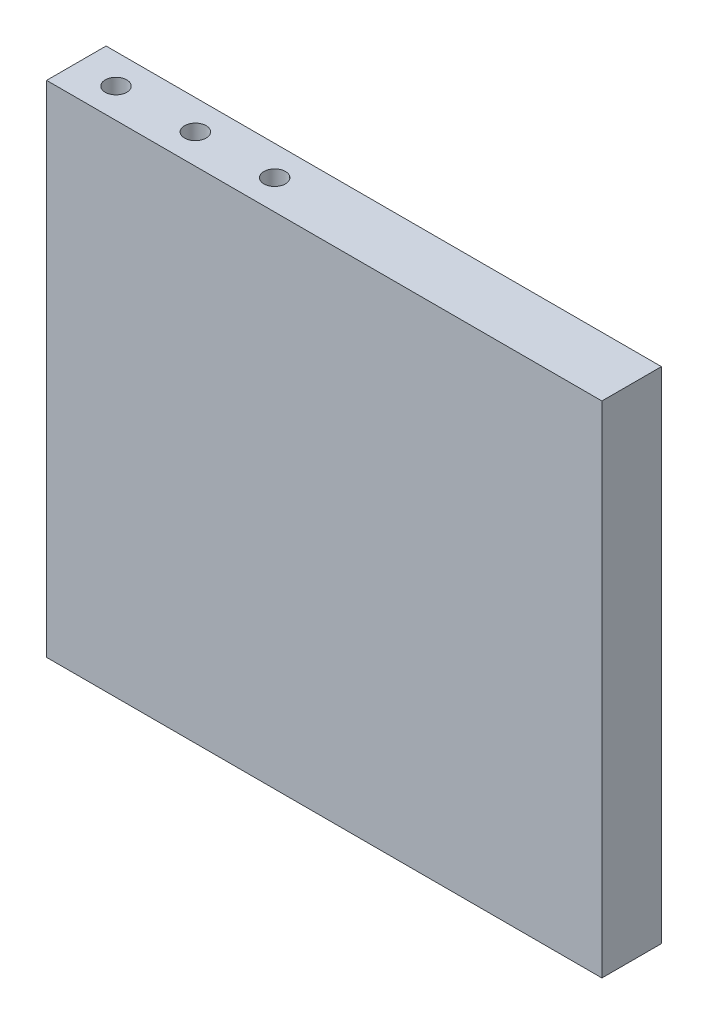
ISO-10303-21;
HEADER;
FILE_DESCRIPTION(('STEP AP214'),'2;1');
FILE_NAME('part.step','',(''),(''),'','','');
FILE_SCHEMA(('AUTOMOTIVE_DESIGN { 1 0 10303 214 1 1 1 1 }'));
ENDSEC;
DATA;
#1=APPLICATION_CONTEXT('core data for automotive mechanical design processes');
#2=APPLICATION_PROTOCOL_DEFINITION('international standard','automotive_design',2000,#1);
#3=PRODUCT_CONTEXT('',#1,'mechanical');
#4=PRODUCT('Part','Part','',(#3));
#5=PRODUCT_RELATED_PRODUCT_CATEGORY('part','',(#4));
#6=PRODUCT_DEFINITION_FORMATION('','',#4);
#7=PRODUCT_DEFINITION_CONTEXT('part definition',#1,'design');
#8=PRODUCT_DEFINITION('design','',#6,#7);
#9=PRODUCT_DEFINITION_SHAPE('','',#8);
#10=(LENGTH_UNIT() NAMED_UNIT(*) SI_UNIT(.MILLI.,.METRE.));
#11=(NAMED_UNIT(*) PLANE_ANGLE_UNIT() SI_UNIT($,.RADIAN.));
#12=(NAMED_UNIT(*) SI_UNIT($,.STERADIAN.) SOLID_ANGLE_UNIT());
#13=UNCERTAINTY_MEASURE_WITH_UNIT(LENGTH_MEASURE(1.E-05),#10,'distance_accuracy_value','');
#14=(GEOMETRIC_REPRESENTATION_CONTEXT(3) GLOBAL_UNCERTAINTY_ASSIGNED_CONTEXT((#13)) GLOBAL_UNIT_ASSIGNED_CONTEXT((#10,
#11,#12)) REPRESENTATION_CONTEXT('',''));
#15=CARTESIAN_POINT('',(0.,0.,0.));
#16=DIRECTION('',(0.,0.,1.));
#17=DIRECTION('',(1.,0.,0.));
#18=AXIS2_PLACEMENT_3D('',#15,#16,#17);
#19=CARTESIAN_POINT('',(-38.691485352155,80.,9.525));
#20=DIRECTION('',(1.,0.,0.));
#21=DIRECTION('',(0.,0.,1.));
#22=AXIS2_PLACEMENT_3D('',#19,#20,#21);
#23=PLANE('',#22);
#24=DIRECTION('',(0.,0.,-1.));
#25=VECTOR('',#24,1.);
#26=CARTESIAN_POINT('',(-38.691485352155,0.,9.525));
#27=LINE('',#26,#25);
#28=CARTESIAN_POINT('',(-38.691485352155,0.,9.525));
#29=VERTEX_POINT('',#28);
#30=CARTESIAN_POINT('',(-38.691485352155,0.,0.));
#31=VERTEX_POINT('',#30);
#32=EDGE_CURVE('E170',#29,#31,#27,.T.);
#33=ORIENTED_EDGE('',*,*,#32,.F.);
#34=DIRECTION('',(0.,-1.,0.));
#35=VECTOR('',#34,1.);
#36=CARTESIAN_POINT('',(-38.691485352155,80.,9.525));
#37=LINE('',#36,#35);
#38=CARTESIAN_POINT('',(-38.691485352155,80.,9.525));
#39=VERTEX_POINT('',#38);
#40=EDGE_CURVE('E179',#39,#29,#37,.T.);
#41=ORIENTED_EDGE('',*,*,#40,.F.);
#42=DIRECTION('',(0.,0.,-1.));
#43=VECTOR('',#42,1.);
#44=CARTESIAN_POINT('',(-38.691485352155,80.,9.525));
#45=LINE('',#44,#43);
#46=CARTESIAN_POINT('',(-38.691485352155,80.,0.));
#47=VERTEX_POINT('',#46);
#48=EDGE_CURVE('E171',#39,#47,#45,.T.);
#49=ORIENTED_EDGE('',*,*,#48,.T.);
#50=DIRECTION('',(0.,-1.,0.));
#51=VECTOR('',#50,1.);
#52=CARTESIAN_POINT('',(-38.691485352155,80.,0.));
#53=LINE('',#52,#51);
#54=EDGE_CURVE('E11',#47,#31,#53,.T.);
#55=ORIENTED_EDGE('',*,*,#54,.T.);
#56=EDGE_LOOP('',(#33,#41,#49,#55));
#57=FACE_BOUND('',#56,.T.);
#58=ADVANCED_FACE('F36',(#57),#23,.F.);
#59=CARTESIAN_POINT('',(-38.691485352155,80.,0.));
#60=DIRECTION('',(0.,0.,1.));
#61=DIRECTION('',(-1.,0.,0.));
#62=AXIS2_PLACEMENT_3D('',#59,#60,#61);
#63=PLANE('',#62);
#64=CARTESIAN_POINT('',(43.858514647845,64.,0.));
#65=DIRECTION('',(0.,0.,1.));
#66=DIRECTION('',(1.,0.,0.));
#67=AXIS2_PLACEMENT_3D('',#64,#65,#66);
#68=CIRCLE('',#67,1.7272);
#69=CARTESIAN_POINT('',(45.585714647845,64.,0.));
#70=VERTEX_POINT('',#69);
#71=EDGE_CURVE('E118',#70,#70,#68,.T.);
#72=ORIENTED_EDGE('',*,*,#71,.T.);
#73=EDGE_LOOP('',(#72));
#74=FACE_BOUND('',#73,.T.);
#75=CARTESIAN_POINT('',(43.858514647845,48.,0.));
#76=DIRECTION('',(0.,0.,1.));
#77=DIRECTION('',(1.,0.,0.));
#78=AXIS2_PLACEMENT_3D('',#75,#76,#77);
#79=CIRCLE('',#78,1.7272);
#80=CARTESIAN_POINT('',(45.585714647845,48.,0.));
#81=VERTEX_POINT('',#80);
#82=EDGE_CURVE('E117',#81,#81,#79,.T.);
#83=ORIENTED_EDGE('',*,*,#82,.T.);
#84=EDGE_LOOP('',(#83));
#85=FACE_BOUND('',#84,.T.);
#86=CARTESIAN_POINT('',(43.858514647845,32.,0.));
#87=DIRECTION('',(0.,0.,1.));
#88=DIRECTION('',(1.,0.,0.));
#89=AXIS2_PLACEMENT_3D('',#86,#87,#88);
#90=CIRCLE('',#89,1.7272);
#91=CARTESIAN_POINT('',(45.585714647845,32.,0.));
#92=VERTEX_POINT('',#91);
#93=EDGE_CURVE('E128',#92,#92,#90,.T.);
#94=ORIENTED_EDGE('',*,*,#93,.T.);
#95=EDGE_LOOP('',(#94));
#96=FACE_BOUND('',#95,.T.);
#97=CARTESIAN_POINT('',(43.858514647845,16.,0.));
#98=DIRECTION('',(0.,0.,1.));
#99=DIRECTION('',(1.,0.,0.));
#100=AXIS2_PLACEMENT_3D('',#97,#98,#99);
#101=CIRCLE('',#100,1.7272);
#102=CARTESIAN_POINT('',(45.585714647845,16.,0.));
#103=VERTEX_POINT('',#102);
#104=EDGE_CURVE('E134',#103,#103,#101,.T.);
#105=ORIENTED_EDGE('',*,*,#104,.T.);
#106=EDGE_LOOP('',(#105));
#107=FACE_BOUND('',#106,.T.);
#108=DIRECTION('',(1.,0.,0.));
#109=VECTOR('',#108,1.);
#110=CARTESIAN_POINT('',(-38.691485352155,0.,0.));
#111=LINE('',#110,#109);
#112=CARTESIAN_POINT('',(50.208514647845,0.,0.));
#113=VERTEX_POINT('',#112);
#114=EDGE_CURVE('E181',#31,#113,#111,.T.);
#115=ORIENTED_EDGE('',*,*,#114,.F.);
#116=ORIENTED_EDGE('',*,*,#54,.F.);
#117=DIRECTION('',(1.,0.,0.));
#118=VECTOR('',#117,1.);
#119=CARTESIAN_POINT('',(-38.691485352155,80.,0.));
#120=LINE('',#119,#118);
#121=CARTESIAN_POINT('',(50.208514647845,80.,0.));
#122=VERTEX_POINT('',#121);
#123=EDGE_CURVE('E78',#47,#122,#120,.T.);
#124=ORIENTED_EDGE('',*,*,#123,.T.);
#125=DIRECTION('',(0.,-1.,0.));
#126=VECTOR('',#125,1.);
#127=CARTESIAN_POINT('',(50.208514647845,80.,0.));
#128=LINE('',#127,#126);
#129=EDGE_CURVE('E44',#122,#113,#128,.T.);
#130=ORIENTED_EDGE('',*,*,#129,.T.);
#131=EDGE_LOOP('',(#115,#116,#124,#130));
#132=FACE_BOUND('',#131,.T.);
#133=ADVANCED_FACE('F192',(#74,#85,#96,#107,#132),#63,.F.);
#134=CARTESIAN_POINT('',(50.208514647845,80.,9.525));
#135=DIRECTION('',(-1.,0.,0.));
#136=DIRECTION('',(0.,0.,-1.));
#137=AXIS2_PLACEMENT_3D('',#134,#135,#136);
#138=PLANE('',#137);
#139=DIRECTION('',(0.,0.,1.));
#140=VECTOR('',#139,1.);
#141=CARTESIAN_POINT('',(50.208514647845,0.,9.525));
#142=LINE('',#141,#140);
#143=CARTESIAN_POINT('',(50.208514647845,0.,9.525));
#144=VERTEX_POINT('',#143);
#145=EDGE_CURVE('E184',#113,#144,#142,.T.);
#146=ORIENTED_EDGE('',*,*,#145,.F.);
#147=ORIENTED_EDGE('',*,*,#129,.F.);
#148=DIRECTION('',(0.,0.,1.));
#149=VECTOR('',#148,1.);
#150=CARTESIAN_POINT('',(50.208514647845,80.,9.525));
#151=LINE('',#150,#149);
#152=CARTESIAN_POINT('',(50.208514647845,80.,9.525));
#153=VERTEX_POINT('',#152);
#154=EDGE_CURVE('E175',#122,#153,#151,.T.);
#155=ORIENTED_EDGE('',*,*,#154,.T.);
#156=DIRECTION('',(0.,-1.,0.));
#157=VECTOR('',#156,1.);
#158=CARTESIAN_POINT('',(50.208514647845,80.,9.525));
#159=LINE('',#158,#157);
#160=EDGE_CURVE('E188',#153,#144,#159,.T.);
#161=ORIENTED_EDGE('',*,*,#160,.T.);
#162=EDGE_LOOP('',(#146,#147,#155,#161));
#163=FACE_BOUND('',#162,.T.);
#164=ADVANCED_FACE('F200',(#163),#138,.F.);
#165=CARTESIAN_POINT('',(-38.691485352155,80.,9.525));
#166=DIRECTION('',(0.,0.,-1.));
#167=DIRECTION('',(1.,0.,0.));
#168=AXIS2_PLACEMENT_3D('',#165,#166,#167);
#169=PLANE('',#168);
#170=DIRECTION('',(-1.,0.,0.));
#171=VECTOR('',#170,1.);
#172=CARTESIAN_POINT('',(-38.691485352155,0.,9.525));
#173=LINE('',#172,#171);
#174=EDGE_CURVE('E67',#144,#29,#173,.T.);
#175=ORIENTED_EDGE('',*,*,#174,.F.);
#176=ORIENTED_EDGE('',*,*,#160,.F.);
#177=DIRECTION('',(-1.,0.,0.));
#178=VECTOR('',#177,1.);
#179=CARTESIAN_POINT('',(-38.691485352155,80.,9.525));
#180=LINE('',#179,#178);
#181=EDGE_CURVE('E52',#153,#39,#180,.T.);
#182=ORIENTED_EDGE('',*,*,#181,.T.);
#183=ORIENTED_EDGE('',*,*,#40,.T.);
#184=EDGE_LOOP('',(#175,#176,#182,#183));
#185=FACE_BOUND('',#184,.T.);
#186=ADVANCED_FACE('F199',(#185),#169,.F.);
#187=CARTESIAN_POINT('',(0.,80.,0.));
#188=DIRECTION('',(0.,1.,0.));
#189=DIRECTION('',(0.,0.,-1.));
#190=AXIS2_PLACEMENT_3D('',#187,#188,#189);
#191=PLANE('',#190);
#192=CARTESIAN_POINT('',(-32.341485352155,80.,4.7625));
#193=DIRECTION('',(0.,-1.,0.));
#194=DIRECTION('',(0.,0.,-1.));
#195=AXIS2_PLACEMENT_3D('',#192,#193,#194);
#196=CIRCLE('',#195,1.7272);
#197=CARTESIAN_POINT('',(-32.341485352155,80.,3.0353));
#198=VERTEX_POINT('',#197);
#199=EDGE_CURVE('E140',#198,#198,#196,.T.);
#200=ORIENTED_EDGE('',*,*,#199,.T.);
#201=EDGE_LOOP('',(#200));
#202=FACE_BOUND('',#201,.T.);
#203=CARTESIAN_POINT('',(-19.641485352155,80.,4.7625));
#204=DIRECTION('',(0.,-1.,0.));
#205=DIRECTION('',(0.,0.,-1.));
#206=AXIS2_PLACEMENT_3D('',#203,#204,#205);
#207=CIRCLE('',#206,1.7272);
#208=CARTESIAN_POINT('',(-19.641485352155,80.,3.0353));
#209=VERTEX_POINT('',#208);
#210=EDGE_CURVE('E146',#209,#209,#207,.T.);
#211=ORIENTED_EDGE('',*,*,#210,.T.);
#212=EDGE_LOOP('',(#211));
#213=FACE_BOUND('',#212,.T.);
#214=CARTESIAN_POINT('',(-6.94148535215502,80.,4.7625));
#215=DIRECTION('',(0.,-1.,0.));
#216=DIRECTION('',(0.,0.,-1.));
#217=AXIS2_PLACEMENT_3D('',#214,#215,#216);
#218=CIRCLE('',#217,1.7272);
#219=CARTESIAN_POINT('',(-6.94148535215502,80.,3.0353));
#220=VERTEX_POINT('',#219);
#221=EDGE_CURVE('E152',#220,#220,#218,.T.);
#222=ORIENTED_EDGE('',*,*,#221,.T.);
#223=EDGE_LOOP('',(#222));
#224=FACE_BOUND('',#223,.T.);
#225=ORIENTED_EDGE('',*,*,#48,.F.);
#226=ORIENTED_EDGE('',*,*,#181,.F.);
#227=ORIENTED_EDGE('',*,*,#154,.F.);
#228=ORIENTED_EDGE('',*,*,#123,.F.);
#229=EDGE_LOOP('',(#225,#226,#227,#228));
#230=FACE_BOUND('',#229,.T.);
#231=ADVANCED_FACE('F198',(#202,#213,#224,#230),#191,.T.);
#232=CARTESIAN_POINT('',(0.,0.,0.));
#233=DIRECTION('',(0.,1.,0.));
#234=DIRECTION('',(0.,0.,-1.));
#235=AXIS2_PLACEMENT_3D('',#232,#233,#234);
#236=PLANE('',#235);
#237=CARTESIAN_POINT('',(-25.991485352155,0.,4.7625));
#238=DIRECTION('',(0.,1.,0.));
#239=DIRECTION('',(0.,0.,1.));
#240=AXIS2_PLACEMENT_3D('',#237,#238,#239);
#241=CIRCLE('',#240,1.7272);
#242=CARTESIAN_POINT('',(-25.991485352155,0.,6.4897));
#243=VERTEX_POINT('',#242);
#244=EDGE_CURVE('E158',#243,#243,#241,.T.);
#245=ORIENTED_EDGE('',*,*,#244,.T.);
#246=EDGE_LOOP('',(#245));
#247=FACE_BOUND('',#246,.T.);
#248=CARTESIAN_POINT('',(12.108514647845,0.,4.7625));
#249=DIRECTION('',(0.,1.,0.));
#250=DIRECTION('',(0.,0.,1.));
#251=AXIS2_PLACEMENT_3D('',#248,#249,#250);
#252=CIRCLE('',#251,1.7272);
#253=CARTESIAN_POINT('',(12.108514647845,0.,6.4897));
#254=VERTEX_POINT('',#253);
#255=EDGE_CURVE('E164',#254,#254,#252,.T.);
#256=ORIENTED_EDGE('',*,*,#255,.T.);
#257=EDGE_LOOP('',(#256));
#258=FACE_BOUND('',#257,.T.);
#259=ORIENTED_EDGE('',*,*,#32,.T.);
#260=ORIENTED_EDGE('',*,*,#114,.T.);
#261=ORIENTED_EDGE('',*,*,#145,.T.);
#262=ORIENTED_EDGE('',*,*,#174,.T.);
#263=EDGE_LOOP('',(#259,#260,#261,#262));
#264=FACE_BOUND('',#263,.T.);
#265=ADVANCED_FACE('F194',(#247,#258,#264),#236,.F.);
#266=CARTESIAN_POINT('',(12.108514647845,10.668,4.7625));
#267=DIRECTION('',(0.,-1.,0.));
#268=DIRECTION('',(0.,0.,1.));
#269=AXIS2_PLACEMENT_3D('',#266,#267,#268);
#270=CONICAL_SURFACE('',#269,1.7272,1.02974425867665);
#271=CARTESIAN_POINT('',(12.108514647845,11.7058064611844,4.7625));
#272=VERTEX_POINT('',#271);
#273=VERTEX_LOOP('',#272);
#274=FACE_BOUND('',#273,.T.);
#275=CARTESIAN_POINT('',(12.108514647845,10.668,4.7625));
#276=DIRECTION('',(0.,1.,0.));
#277=DIRECTION('',(0.,0.,1.));
#278=AXIS2_PLACEMENT_3D('',#275,#276,#277);
#279=CIRCLE('',#278,1.7272);
#280=CARTESIAN_POINT('',(12.108514647845,10.668,6.4897));
#281=VERTEX_POINT('',#280);
#282=EDGE_CURVE('E167',#281,#281,#279,.T.);
#283=ORIENTED_EDGE('',*,*,#282,.F.);
#284=EDGE_LOOP('',(#283));
#285=FACE_BOUND('',#284,.T.);
#286=ADVANCED_FACE('F246',(#274,#285),#270,.F.);
#287=CARTESIAN_POINT('',(12.108514647845,0.,4.7625));
#288=DIRECTION('',(0.,-1.,0.));
#289=DIRECTION('',(0.,0.,1.));
#290=AXIS2_PLACEMENT_3D('',#287,#288,#289);
#291=CYLINDRICAL_SURFACE('',#290,1.7272);
#292=ORIENTED_EDGE('',*,*,#282,.T.);
#293=EDGE_LOOP('',(#292));
#294=FACE_BOUND('',#293,.T.);
#295=ORIENTED_EDGE('',*,*,#255,.F.);
#296=EDGE_LOOP('',(#295));
#297=FACE_BOUND('',#296,.T.);
#298=ADVANCED_FACE('F256',(#294,#297),#291,.F.);
#299=CARTESIAN_POINT('',(-25.991485352155,10.668,4.7625));
#300=DIRECTION('',(0.,-1.,0.));
#301=DIRECTION('',(0.,0.,1.));
#302=AXIS2_PLACEMENT_3D('',#299,#300,#301);
#303=CONICAL_SURFACE('',#302,1.7272,1.02974425867665);
#304=CARTESIAN_POINT('',(-25.991485352155,11.7058064611844,4.7625));
#305=VERTEX_POINT('',#304);
#306=VERTEX_LOOP('',#305);
#307=FACE_BOUND('',#306,.T.);
#308=CARTESIAN_POINT('',(-25.991485352155,10.668,4.7625));
#309=DIRECTION('',(0.,1.,0.));
#310=DIRECTION('',(0.,0.,1.));
#311=AXIS2_PLACEMENT_3D('',#308,#309,#310);
#312=CIRCLE('',#311,1.7272);
#313=CARTESIAN_POINT('',(-25.991485352155,10.668,6.4897));
#314=VERTEX_POINT('',#313);
#315=EDGE_CURVE('E161',#314,#314,#312,.T.);
#316=ORIENTED_EDGE('',*,*,#315,.F.);
#317=EDGE_LOOP('',(#316));
#318=FACE_BOUND('',#317,.T.);
#319=ADVANCED_FACE('F267',(#307,#318),#303,.F.);
#320=CARTESIAN_POINT('',(-25.991485352155,0.,4.7625));
#321=DIRECTION('',(0.,-1.,0.));
#322=DIRECTION('',(0.,0.,1.));
#323=AXIS2_PLACEMENT_3D('',#320,#321,#322);
#324=CYLINDRICAL_SURFACE('',#323,1.7272);
#325=ORIENTED_EDGE('',*,*,#315,.T.);
#326=EDGE_LOOP('',(#325));
#327=FACE_BOUND('',#326,.T.);
#328=ORIENTED_EDGE('',*,*,#244,.F.);
#329=EDGE_LOOP('',(#328));
#330=FACE_BOUND('',#329,.T.);
#331=ADVANCED_FACE('F278',(#327,#330),#324,.F.);
#332=CARTESIAN_POINT('',(-6.94148535215502,69.332,4.7625));
#333=DIRECTION('',(0.,1.,0.));
#334=DIRECTION('',(0.,0.,-1.));
#335=AXIS2_PLACEMENT_3D('',#332,#333,#334);
#336=CONICAL_SURFACE('',#335,1.7272,1.02974425867665);
#337=CARTESIAN_POINT('',(-6.94148535215503,68.2941935388156,4.7625));
#338=VERTEX_POINT('',#337);
#339=VERTEX_LOOP('',#338);
#340=FACE_BOUND('',#339,.T.);
#341=CARTESIAN_POINT('',(-6.94148535215502,69.332,4.7625));
#342=DIRECTION('',(0.,-1.,0.));
#343=DIRECTION('',(0.,0.,-1.));
#344=AXIS2_PLACEMENT_3D('',#341,#342,#343);
#345=CIRCLE('',#344,1.7272);
#346=CARTESIAN_POINT('',(-6.94148535215502,69.332,3.0353));
#347=VERTEX_POINT('',#346);
#348=EDGE_CURVE('E155',#347,#347,#345,.T.);
#349=ORIENTED_EDGE('',*,*,#348,.F.);
#350=EDGE_LOOP('',(#349));
#351=FACE_BOUND('',#350,.T.);
#352=ADVANCED_FACE('F289',(#340,#351),#336,.F.);
#353=CARTESIAN_POINT('',(-6.94148535215502,80.,4.7625));
#354=DIRECTION('',(0.,1.,0.));
#355=DIRECTION('',(0.,0.,-1.));
#356=AXIS2_PLACEMENT_3D('',#353,#354,#355);
#357=CYLINDRICAL_SURFACE('',#356,1.7272);
#358=ORIENTED_EDGE('',*,*,#348,.T.);
#359=EDGE_LOOP('',(#358));
#360=FACE_BOUND('',#359,.T.);
#361=ORIENTED_EDGE('',*,*,#221,.F.);
#362=EDGE_LOOP('',(#361));
#363=FACE_BOUND('',#362,.T.);
#364=ADVANCED_FACE('F300',(#360,#363),#357,.F.);
#365=CARTESIAN_POINT('',(-19.641485352155,69.332,4.7625));
#366=DIRECTION('',(0.,1.,0.));
#367=DIRECTION('',(0.,0.,-1.));
#368=AXIS2_PLACEMENT_3D('',#365,#366,#367);
#369=CONICAL_SURFACE('',#368,1.7272,1.02974425867665);
#370=CARTESIAN_POINT('',(-19.641485352155,68.2941935388156,4.7625));
#371=VERTEX_POINT('',#370);
#372=VERTEX_LOOP('',#371);
#373=FACE_BOUND('',#372,.T.);
#374=CARTESIAN_POINT('',(-19.641485352155,69.332,4.7625));
#375=DIRECTION('',(0.,-1.,0.));
#376=DIRECTION('',(0.,0.,-1.));
#377=AXIS2_PLACEMENT_3D('',#374,#375,#376);
#378=CIRCLE('',#377,1.7272);
#379=CARTESIAN_POINT('',(-19.641485352155,69.332,3.0353));
#380=VERTEX_POINT('',#379);
#381=EDGE_CURVE('E149',#380,#380,#378,.T.);
#382=ORIENTED_EDGE('',*,*,#381,.F.);
#383=EDGE_LOOP('',(#382));
#384=FACE_BOUND('',#383,.T.);
#385=ADVANCED_FACE('F311',(#373,#384),#369,.F.);
#386=CARTESIAN_POINT('',(-19.641485352155,80.,4.7625));
#387=DIRECTION('',(0.,1.,0.));
#388=DIRECTION('',(0.,0.,-1.));
#389=AXIS2_PLACEMENT_3D('',#386,#387,#388);
#390=CYLINDRICAL_SURFACE('',#389,1.7272);
#391=ORIENTED_EDGE('',*,*,#381,.T.);
#392=EDGE_LOOP('',(#391));
#393=FACE_BOUND('',#392,.T.);
#394=ORIENTED_EDGE('',*,*,#210,.F.);
#395=EDGE_LOOP('',(#394));
#396=FACE_BOUND('',#395,.T.);
#397=ADVANCED_FACE('F322',(#393,#396),#390,.F.);
#398=CARTESIAN_POINT('',(-32.341485352155,69.332,4.7625));
#399=DIRECTION('',(0.,1.,0.));
#400=DIRECTION('',(0.,0.,-1.));
#401=AXIS2_PLACEMENT_3D('',#398,#399,#400);
#402=CONICAL_SURFACE('',#401,1.7272,1.02974425867666);
#403=CARTESIAN_POINT('',(-32.341485352155,68.2941935388156,4.7625));
#404=VERTEX_POINT('',#403);
#405=VERTEX_LOOP('',#404);
#406=FACE_BOUND('',#405,.T.);
#407=CARTESIAN_POINT('',(-32.341485352155,69.332,4.7625));
#408=DIRECTION('',(0.,-1.,0.));
#409=DIRECTION('',(0.,0.,-1.));
#410=AXIS2_PLACEMENT_3D('',#407,#408,#409);
#411=CIRCLE('',#410,1.7272);
#412=CARTESIAN_POINT('',(-32.341485352155,69.332,3.0353));
#413=VERTEX_POINT('',#412);
#414=EDGE_CURVE('E143',#413,#413,#411,.T.);
#415=ORIENTED_EDGE('',*,*,#414,.F.);
#416=EDGE_LOOP('',(#415));
#417=FACE_BOUND('',#416,.T.);
#418=ADVANCED_FACE('F333',(#406,#417),#402,.F.);
#419=CARTESIAN_POINT('',(-32.341485352155,80.,4.7625));
#420=DIRECTION('',(0.,1.,0.));
#421=DIRECTION('',(0.,0.,-1.));
#422=AXIS2_PLACEMENT_3D('',#419,#420,#421);
#423=CYLINDRICAL_SURFACE('',#422,1.7272);
#424=ORIENTED_EDGE('',*,*,#414,.T.);
#425=EDGE_LOOP('',(#424));
#426=FACE_BOUND('',#425,.T.);
#427=ORIENTED_EDGE('',*,*,#199,.F.);
#428=EDGE_LOOP('',(#427));
#429=FACE_BOUND('',#428,.T.);
#430=ADVANCED_FACE('F344',(#426,#429),#423,.F.);
#431=CARTESIAN_POINT('',(43.858514647845,16.,7.62));
#432=DIRECTION('',(0.,0.,-1.));
#433=DIRECTION('',(1.,0.,0.));
#434=AXIS2_PLACEMENT_3D('',#431,#432,#433);
#435=CONICAL_SURFACE('',#434,1.7272,1.02974425867665);
#436=CARTESIAN_POINT('',(43.858514647845,16.,8.6578064611844));
#437=VERTEX_POINT('',#436);
#438=VERTEX_LOOP('',#437);
#439=FACE_BOUND('',#438,.T.);
#440=CARTESIAN_POINT('',(43.858514647845,16.,7.62));
#441=DIRECTION('',(0.,0.,1.));
#442=DIRECTION('',(1.,0.,0.));
#443=AXIS2_PLACEMENT_3D('',#440,#441,#442);
#444=CIRCLE('',#443,1.7272);
#445=CARTESIAN_POINT('',(45.585714647845,16.,7.62));
#446=VERTEX_POINT('',#445);
#447=EDGE_CURVE('E137',#446,#446,#444,.T.);
#448=ORIENTED_EDGE('',*,*,#447,.F.);
#449=EDGE_LOOP('',(#448));
#450=FACE_BOUND('',#449,.T.);
#451=ADVANCED_FACE('F355',(#439,#450),#435,.F.);
#452=CARTESIAN_POINT('',(43.858514647845,16.,0.));
#453=DIRECTION('',(0.,0.,-1.));
#454=DIRECTION('',(1.,0.,0.));
#455=AXIS2_PLACEMENT_3D('',#452,#453,#454);
#456=CYLINDRICAL_SURFACE('',#455,1.7272);
#457=ORIENTED_EDGE('',*,*,#447,.T.);
#458=EDGE_LOOP('',(#457));
#459=FACE_BOUND('',#458,.T.);
#460=ORIENTED_EDGE('',*,*,#104,.F.);
#461=EDGE_LOOP('',(#460));
#462=FACE_BOUND('',#461,.T.);
#463=ADVANCED_FACE('F366',(#459,#462),#456,.F.);
#464=CARTESIAN_POINT('',(43.858514647845,32.,7.62));
#465=DIRECTION('',(0.,0.,-1.));
#466=DIRECTION('',(1.,0.,0.));
#467=AXIS2_PLACEMENT_3D('',#464,#465,#466);
#468=CONICAL_SURFACE('',#467,1.7272,1.02974425867665);
#469=CARTESIAN_POINT('',(43.858514647845,32.,8.6578064611844));
#470=VERTEX_POINT('',#469);
#471=VERTEX_LOOP('',#470);
#472=FACE_BOUND('',#471,.T.);
#473=CARTESIAN_POINT('',(43.858514647845,32.,7.62));
#474=DIRECTION('',(0.,0.,1.));
#475=DIRECTION('',(1.,0.,0.));
#476=AXIS2_PLACEMENT_3D('',#473,#474,#475);
#477=CIRCLE('',#476,1.7272);
#478=CARTESIAN_POINT('',(45.585714647845,32.,7.62));
#479=VERTEX_POINT('',#478);
#480=EDGE_CURVE('E131',#479,#479,#477,.T.);
#481=ORIENTED_EDGE('',*,*,#480,.F.);
#482=EDGE_LOOP('',(#481));
#483=FACE_BOUND('',#482,.T.);
#484=ADVANCED_FACE('F377',(#472,#483),#468,.F.);
#485=CARTESIAN_POINT('',(43.858514647845,32.,0.));
#486=DIRECTION('',(0.,0.,-1.));
#487=DIRECTION('',(1.,0.,0.));
#488=AXIS2_PLACEMENT_3D('',#485,#486,#487);
#489=CYLINDRICAL_SURFACE('',#488,1.7272);
#490=ORIENTED_EDGE('',*,*,#480,.T.);
#491=EDGE_LOOP('',(#490));
#492=FACE_BOUND('',#491,.T.);
#493=ORIENTED_EDGE('',*,*,#93,.F.);
#494=EDGE_LOOP('',(#493));
#495=FACE_BOUND('',#494,.T.);
#496=ADVANCED_FACE('F388',(#492,#495),#489,.F.);
#497=CARTESIAN_POINT('',(43.858514647845,48.,7.62));
#498=DIRECTION('',(0.,0.,-1.));
#499=DIRECTION('',(1.,0.,0.));
#500=AXIS2_PLACEMENT_3D('',#497,#498,#499);
#501=CONICAL_SURFACE('',#500,1.7272,1.02974425867665);
#502=CARTESIAN_POINT('',(43.858514647845,48.,8.6578064611844));
#503=VERTEX_POINT('',#502);
#504=VERTEX_LOOP('',#503);
#505=FACE_BOUND('',#504,.T.);
#506=CARTESIAN_POINT('',(43.858514647845,48.,7.62));
#507=DIRECTION('',(0.,0.,1.));
#508=DIRECTION('',(1.,0.,0.));
#509=AXIS2_PLACEMENT_3D('',#506,#507,#508);
#510=CIRCLE('',#509,1.7272);
#511=CARTESIAN_POINT('',(45.585714647845,48.,7.62));
#512=VERTEX_POINT('',#511);
#513=EDGE_CURVE('E121',#512,#512,#510,.T.);
#514=ORIENTED_EDGE('',*,*,#513,.F.);
#515=EDGE_LOOP('',(#514));
#516=FACE_BOUND('',#515,.T.);
#517=ADVANCED_FACE('F399',(#505,#516),#501,.F.);
#518=CARTESIAN_POINT('',(43.858514647845,48.,0.));
#519=DIRECTION('',(0.,0.,-1.));
#520=DIRECTION('',(1.,0.,0.));
#521=AXIS2_PLACEMENT_3D('',#518,#519,#520);
#522=CYLINDRICAL_SURFACE('',#521,1.7272);
#523=ORIENTED_EDGE('',*,*,#513,.T.);
#524=EDGE_LOOP('',(#523));
#525=FACE_BOUND('',#524,.T.);
#526=ORIENTED_EDGE('',*,*,#82,.F.);
#527=EDGE_LOOP('',(#526));
#528=FACE_BOUND('',#527,.T.);
#529=ADVANCED_FACE('F111',(#525,#528),#522,.F.);
#530=CARTESIAN_POINT('',(43.858514647845,64.,7.62));
#531=DIRECTION('',(0.,0.,-1.));
#532=DIRECTION('',(1.,0.,0.));
#533=AXIS2_PLACEMENT_3D('',#530,#531,#532);
#534=CONICAL_SURFACE('',#533,1.7272,1.02974425867665);
#535=CARTESIAN_POINT('',(43.858514647845,64.,8.6578064611844));
#536=VERTEX_POINT('',#535);
#537=VERTEX_LOOP('',#536);
#538=FACE_BOUND('',#537,.T.);
#539=CARTESIAN_POINT('',(43.858514647845,64.,7.62));
#540=DIRECTION('',(0.,0.,1.));
#541=DIRECTION('',(1.,0.,0.));
#542=AXIS2_PLACEMENT_3D('',#539,#540,#541);
#543=CIRCLE('',#542,1.7272);
#544=CARTESIAN_POINT('',(45.585714647845,64.,7.62));
#545=VERTEX_POINT('',#544);
#546=EDGE_CURVE('E115',#545,#545,#543,.T.);
#547=ORIENTED_EDGE('',*,*,#546,.F.);
#548=EDGE_LOOP('',(#547));
#549=FACE_BOUND('',#548,.T.);
#550=ADVANCED_FACE('F107',(#538,#549),#534,.F.);
#551=CARTESIAN_POINT('',(43.858514647845,64.,0.));
#552=DIRECTION('',(0.,0.,-1.));
#553=DIRECTION('',(1.,0.,0.));
#554=AXIS2_PLACEMENT_3D('',#551,#552,#553);
#555=CYLINDRICAL_SURFACE('',#554,1.7272);
#556=ORIENTED_EDGE('',*,*,#546,.T.);
#557=EDGE_LOOP('',(#556));
#558=FACE_BOUND('',#557,.T.);
#559=ORIENTED_EDGE('',*,*,#71,.F.);
#560=EDGE_LOOP('',(#559));
#561=FACE_BOUND('',#560,.T.);
#562=ADVANCED_FACE('F110',(#558,#561),#555,.F.);
#563=CLOSED_SHELL('',(#58,#133,#164,#186,#231,#265,#286,#298,#319,#331,#352,#364,#385,#397,#418,
#430,#451,#463,#484,#496,#517,#529,#550,#562));
#564=MANIFOLD_SOLID_BREP('B2',#563);
#565=ADVANCED_BREP_SHAPE_REPRESENTATION('',(#18,#564),#14);
#566=SHAPE_DEFINITION_REPRESENTATION(#9,#565);
ENDSEC;
END-ISO-10303-21;
